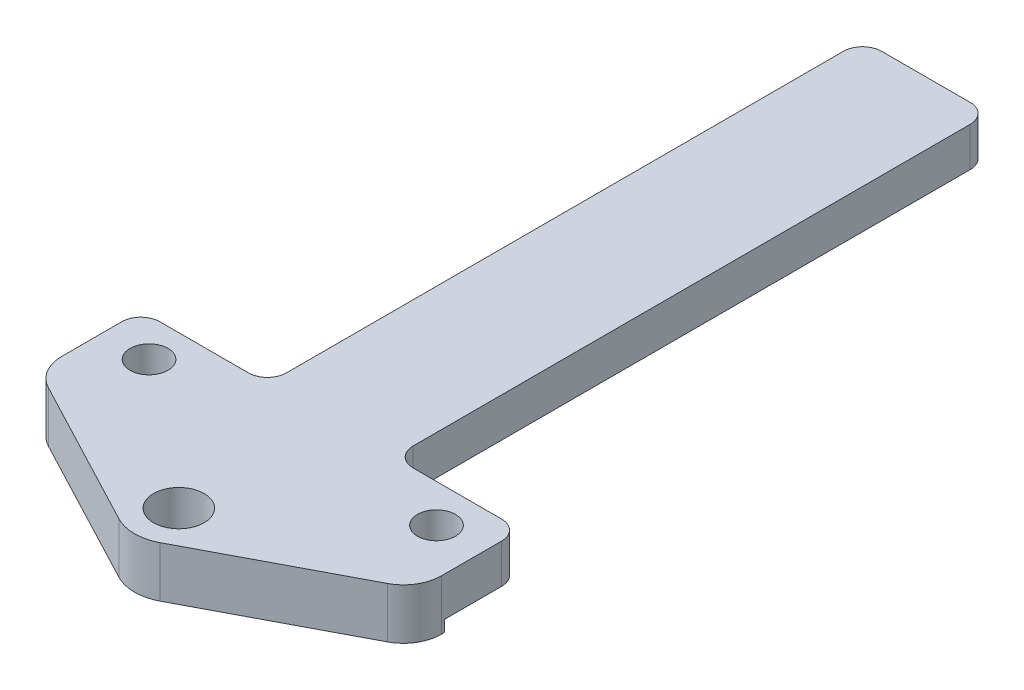
ISO-10303-21;
HEADER;
FILE_DESCRIPTION(('STEP AP214'),'2;1');
FILE_NAME('part.step','',(''),(''),'','','');
FILE_SCHEMA(('AUTOMOTIVE_DESIGN { 1 0 10303 214 1 1 1 1 }'));
ENDSEC;
DATA;
#1=APPLICATION_CONTEXT('core data for automotive mechanical design processes');
#2=APPLICATION_PROTOCOL_DEFINITION('international standard','automotive_design',2000,#1);
#3=PRODUCT_CONTEXT('',#1,'mechanical');
#4=PRODUCT('Part','Part','',(#3));
#5=PRODUCT_RELATED_PRODUCT_CATEGORY('part','',(#4));
#6=PRODUCT_DEFINITION_FORMATION('','',#4);
#7=PRODUCT_DEFINITION_CONTEXT('part definition',#1,'design');
#8=PRODUCT_DEFINITION('design','',#6,#7);
#9=PRODUCT_DEFINITION_SHAPE('','',#8);
#10=(LENGTH_UNIT() NAMED_UNIT(*) SI_UNIT(.MILLI.,.METRE.));
#11=(NAMED_UNIT(*) PLANE_ANGLE_UNIT() SI_UNIT($,.RADIAN.));
#12=(NAMED_UNIT(*) SI_UNIT($,.STERADIAN.) SOLID_ANGLE_UNIT());
#13=UNCERTAINTY_MEASURE_WITH_UNIT(LENGTH_MEASURE(1.E-05),#10,'distance_accuracy_value','');
#14=(GEOMETRIC_REPRESENTATION_CONTEXT(3) GLOBAL_UNCERTAINTY_ASSIGNED_CONTEXT((#13)) GLOBAL_UNIT_ASSIGNED_CONTEXT((#10,
#11,#12)) REPRESENTATION_CONTEXT('',''));
#15=CARTESIAN_POINT('',(0.,0.,0.));
#16=DIRECTION('',(0.,0.,1.));
#17=DIRECTION('',(1.,0.,0.));
#18=AXIS2_PLACEMENT_3D('',#15,#16,#17);
#19=CARTESIAN_POINT('',(12.,2.,-5.74612507928939));
#20=DIRECTION('',(0.,-1.,0.));
#21=DIRECTION('',(0.,0.,-1.));
#22=AXIS2_PLACEMENT_3D('',#19,#20,#21);
#23=PLANE('',#22);
#24=DIRECTION('',(0.,0.,-1.));
#25=VECTOR('',#24,1.);
#26=CARTESIAN_POINT('',(5.,2.,-59.));
#27=LINE('',#26,#25);
#28=CARTESIAN_POINT('',(5.,2.,-13.5));
#29=VERTEX_POINT('',#28);
#30=CARTESIAN_POINT('',(5.,2.,-57.5));
#31=VERTEX_POINT('',#30);
#32=EDGE_CURVE('E254',#29,#31,#27,.T.);
#33=ORIENTED_EDGE('',*,*,#32,.T.);
#34=CARTESIAN_POINT('',(3.5,2.,-57.5));
#35=DIRECTION('',(0.,-1.,0.));
#36=DIRECTION('',(0.,0.,-1.));
#37=AXIS2_PLACEMENT_3D('',#34,#35,#36);
#38=CIRCLE('',#37,1.5);
#39=CARTESIAN_POINT('',(3.5,2.,-59.));
#40=VERTEX_POINT('',#39);
#41=EDGE_CURVE('E334',#31,#40,#38,.F.);
#42=ORIENTED_EDGE('',*,*,#41,.T.);
#43=DIRECTION('',(-1.,0.,0.));
#44=VECTOR('',#43,1.);
#45=CARTESIAN_POINT('',(-5.,2.,-59.));
#46=LINE('',#45,#44);
#47=CARTESIAN_POINT('',(-3.5,2.,-59.));
#48=VERTEX_POINT('',#47);
#49=EDGE_CURVE('E257',#40,#48,#46,.T.);
#50=ORIENTED_EDGE('',*,*,#49,.T.);
#51=CARTESIAN_POINT('',(-3.5,2.,-57.5));
#52=DIRECTION('',(0.,-1.,0.));
#53=DIRECTION('',(0.,0.,-1.));
#54=AXIS2_PLACEMENT_3D('',#51,#52,#53);
#55=CIRCLE('',#54,1.5);
#56=CARTESIAN_POINT('',(-5.,2.,-57.5));
#57=VERTEX_POINT('',#56);
#58=EDGE_CURVE('E332',#48,#57,#55,.F.);
#59=ORIENTED_EDGE('',*,*,#58,.T.);
#60=DIRECTION('',(0.,0.,1.));
#61=VECTOR('',#60,1.);
#62=CARTESIAN_POINT('',(-5.,2.,-59.));
#63=LINE('',#62,#61);
#64=CARTESIAN_POINT('',(-5.,2.,-13.5));
#65=VERTEX_POINT('',#64);
#66=EDGE_CURVE('E260',#57,#65,#63,.T.);
#67=ORIENTED_EDGE('',*,*,#66,.T.);
#68=CARTESIAN_POINT('',(-6.5,2.,-13.5));
#69=DIRECTION('',(0.,-1.,0.));
#70=DIRECTION('',(0.,0.,-1.));
#71=AXIS2_PLACEMENT_3D('',#68,#69,#70);
#72=CIRCLE('',#71,1.5);
#73=CARTESIAN_POINT('',(-6.5,2.,-12.));
#74=VERTEX_POINT('',#73);
#75=EDGE_CURVE('E11',#65,#74,#72,.T.);
#76=ORIENTED_EDGE('',*,*,#75,.T.);
#77=DIRECTION('',(-1.,0.,0.));
#78=VECTOR('',#77,1.);
#79=CARTESIAN_POINT('',(-13.5,2.,-12.));
#80=LINE('',#79,#78);
#81=CARTESIAN_POINT('',(-13.5,2.,-12.));
#82=VERTEX_POINT('',#81);
#83=EDGE_CURVE('E262',#74,#82,#80,.T.);
#84=ORIENTED_EDGE('',*,*,#83,.T.);
#85=CARTESIAN_POINT('',(-13.5,2.,-10.5));
#86=DIRECTION('',(0.,1.,0.));
#87=DIRECTION('',(0.,0.,1.));
#88=AXIS2_PLACEMENT_3D('',#85,#86,#87);
#89=CIRCLE('',#88,1.5);
#90=CARTESIAN_POINT('',(-15.,2.,-10.5));
#91=VERTEX_POINT('',#90);
#92=EDGE_CURVE('E264',#82,#91,#89,.T.);
#93=ORIENTED_EDGE('',*,*,#92,.T.);
#94=DIRECTION('',(0.,0.,1.));
#95=VECTOR('',#94,1.);
#96=CARTESIAN_POINT('',(-15.,2.,-10.5));
#97=LINE('',#96,#95);
#98=CARTESIAN_POINT('',(-15.,2.,-5.7461250792894));
#99=VERTEX_POINT('',#98);
#100=EDGE_CURVE('E266',#91,#99,#97,.T.);
#101=ORIENTED_EDGE('',*,*,#100,.T.);
#102=CARTESIAN_POINT('',(-12.,2.,-5.74612507928939));
#103=DIRECTION('',(0.,1.,0.));
#104=DIRECTION('',(0.,0.,-1.));
#105=AXIS2_PLACEMENT_3D('',#102,#103,#104);
#106=CIRCLE('',#105,3.);
#107=CARTESIAN_POINT('',(-13.3964192830384,2.,-3.09093898676054));
#108=VERTEX_POINT('',#107);
#109=EDGE_CURVE('E268',#99,#108,#106,.T.);
#110=ORIENTED_EDGE('',*,*,#109,.T.);
#111=DIRECTION('',(0.885062030842948,0.,0.465473094346124));
#112=VECTOR('',#111,1.);
#113=CARTESIAN_POINT('',(-1.62915583021145,2.,3.09771710795034));
#114=LINE('',#113,#112);
#115=CARTESIAN_POINT('',(-1.62915583021145,2.,3.09771710795034));
#116=VERTEX_POINT('',#115);
#117=EDGE_CURVE('E270',#108,#116,#114,.T.);
#118=ORIENTED_EDGE('',*,*,#117,.T.);
#119=CARTESIAN_POINT('',(0.,2.,0.));
#120=DIRECTION('',(0.,1.,0.));
#121=DIRECTION('',(0.,0.,1.));
#122=AXIS2_PLACEMENT_3D('',#119,#120,#121);
#123=CIRCLE('',#122,3.50000000000003);
#124=CARTESIAN_POINT('',(1.62915583021145,2.,3.09771710795034));
#125=VERTEX_POINT('',#124);
#126=EDGE_CURVE('E272',#116,#125,#123,.T.);
#127=ORIENTED_EDGE('',*,*,#126,.T.);
#128=DIRECTION('',(0.885062030842948,0.,-0.465473094346124));
#129=VECTOR('',#128,1.);
#130=CARTESIAN_POINT('',(1.62915583021145,2.,3.09771710795034));
#131=LINE('',#130,#129);
#132=CARTESIAN_POINT('',(13.3964192830384,2.,-3.09093898676054));
#133=VERTEX_POINT('',#132);
#134=EDGE_CURVE('E274',#125,#133,#131,.T.);
#135=ORIENTED_EDGE('',*,*,#134,.T.);
#136=CARTESIAN_POINT('',(12.,2.,-5.74612507928939));
#137=DIRECTION('',(0.,1.,0.));
#138=DIRECTION('',(0.,0.,-1.));
#139=AXIS2_PLACEMENT_3D('',#136,#137,#138);
#140=CIRCLE('',#139,3.);
#141=CARTESIAN_POINT('',(15.,2.,-5.7461250792894));
#142=VERTEX_POINT('',#141);
#143=EDGE_CURVE('E243',#133,#142,#140,.T.);
#144=ORIENTED_EDGE('',*,*,#143,.T.);
#145=DIRECTION('',(0.,0.,-1.));
#146=VECTOR('',#145,1.);
#147=CARTESIAN_POINT('',(15.,2.,-10.5));
#148=LINE('',#147,#146);
#149=CARTESIAN_POINT('',(15.,2.,-10.5));
#150=VERTEX_POINT('',#149);
#151=EDGE_CURVE('E246',#142,#150,#148,.T.);
#152=ORIENTED_EDGE('',*,*,#151,.T.);
#153=CARTESIAN_POINT('',(13.5,2.,-10.5));
#154=DIRECTION('',(0.,1.,0.));
#155=DIRECTION('',(0.,0.,1.));
#156=AXIS2_PLACEMENT_3D('',#153,#154,#155);
#157=CIRCLE('',#156,1.5);
#158=CARTESIAN_POINT('',(13.5,2.,-12.));
#159=VERTEX_POINT('',#158);
#160=EDGE_CURVE('E249',#150,#159,#157,.T.);
#161=ORIENTED_EDGE('',*,*,#160,.T.);
#162=DIRECTION('',(-1.,0.,0.));
#163=VECTOR('',#162,1.);
#164=CARTESIAN_POINT('',(5.,2.,-12.));
#165=LINE('',#164,#163);
#166=CARTESIAN_POINT('',(6.5,2.,-12.));
#167=VERTEX_POINT('',#166);
#168=EDGE_CURVE('E251',#159,#167,#165,.T.);
#169=ORIENTED_EDGE('',*,*,#168,.T.);
#170=CARTESIAN_POINT('',(6.5,2.,-13.5));
#171=DIRECTION('',(0.,-1.,0.));
#172=DIRECTION('',(0.,0.,-1.));
#173=AXIS2_PLACEMENT_3D('',#170,#171,#172);
#174=CIRCLE('',#173,1.5);
#175=EDGE_CURVE('E347',#167,#29,#174,.T.);
#176=ORIENTED_EDGE('',*,*,#175,.T.);
#177=EDGE_LOOP('',(#33,#42,#50,#59,#67,#76,#84,#93,#101,#110,#118,#127,#135,#144,#152,#161,#169,#176));
#178=FACE_BOUND('',#177,.T.);
#179=CARTESIAN_POINT('',(0.,2.,0.));
#180=DIRECTION('',(0.,1.,0.));
#181=DIRECTION('',(0.,0.,1.));
#182=AXIS2_PLACEMENT_3D('',#179,#180,#181);
#183=CIRCLE('',#182,2.);
#184=CARTESIAN_POINT('',(0.,2.,2.));
#185=VERTEX_POINT('',#184);
#186=EDGE_CURVE('E237',#185,#185,#183,.T.);
#187=ORIENTED_EDGE('',*,*,#186,.F.);
#188=EDGE_LOOP('',(#187));
#189=FACE_BOUND('',#188,.T.);
#190=CARTESIAN_POINT('',(-11.35,2.,-9.));
#191=DIRECTION('',(0.,1.,0.));
#192=DIRECTION('',(0.,0.,1.));
#193=AXIS2_PLACEMENT_3D('',#190,#191,#192);
#194=CIRCLE('',#193,1.5);
#195=CARTESIAN_POINT('',(-11.35,2.,-7.5));
#196=VERTEX_POINT('',#195);
#197=EDGE_CURVE('E233',#196,#196,#194,.T.);
#198=ORIENTED_EDGE('',*,*,#197,.F.);
#199=EDGE_LOOP('',(#198));
#200=FACE_BOUND('',#199,.T.);
#201=CARTESIAN_POINT('',(11.35,2.,-9.));
#202=DIRECTION('',(0.,1.,0.));
#203=DIRECTION('',(0.,0.,-1.));
#204=AXIS2_PLACEMENT_3D('',#201,#202,#203);
#205=CIRCLE('',#204,1.5);
#206=CARTESIAN_POINT('',(11.35,2.,-10.5));
#207=VERTEX_POINT('',#206);
#208=EDGE_CURVE('E228',#207,#207,#205,.T.);
#209=ORIENTED_EDGE('',*,*,#208,.F.);
#210=EDGE_LOOP('',(#209));
#211=FACE_BOUND('',#210,.T.);
#212=ADVANCED_FACE('F39',(#178,#189,#200,#211),#23,.F.);
#213=CARTESIAN_POINT('',(12.,-2.,-5.74612507928939));
#214=DIRECTION('',(0.,-1.,0.));
#215=DIRECTION('',(0.,0.,-1.));
#216=AXIS2_PLACEMENT_3D('',#213,#214,#215);
#217=PLANE('',#216);
#218=DIRECTION('',(-1.,0.,0.));
#219=VECTOR('',#218,1.);
#220=CARTESIAN_POINT('',(15.001,-2.,-6.));
#221=LINE('',#220,#219);
#222=CARTESIAN_POINT('',(15.,-2.,-6.));
#223=VERTEX_POINT('',#222);
#224=CARTESIAN_POINT('',(-15.,-2.,-6.));
#225=VERTEX_POINT('',#224);
#226=EDGE_CURVE('E189',#223,#225,#221,.T.);
#227=ORIENTED_EDGE('',*,*,#226,.F.);
#228=DIRECTION('',(0.,0.,-1.));
#229=VECTOR('',#228,1.);
#230=CARTESIAN_POINT('',(15.,-2.,-10.5));
#231=LINE('',#230,#229);
#232=CARTESIAN_POINT('',(15.,-2.,-5.7461250792894));
#233=VERTEX_POINT('',#232);
#234=EDGE_CURVE('E279',#233,#223,#231,.T.);
#235=ORIENTED_EDGE('',*,*,#234,.F.);
#236=CARTESIAN_POINT('',(12.,-2.,-5.74612507928939));
#237=DIRECTION('',(0.,1.,0.));
#238=DIRECTION('',(0.,0.,-1.));
#239=AXIS2_PLACEMENT_3D('',#236,#237,#238);
#240=CIRCLE('',#239,3.);
#241=CARTESIAN_POINT('',(13.3964192830384,-2.,-3.09093898676054));
#242=VERTEX_POINT('',#241);
#243=EDGE_CURVE('E240',#242,#233,#240,.T.);
#244=ORIENTED_EDGE('',*,*,#243,.F.);
#245=DIRECTION('',(0.885062030842948,0.,-0.465473094346124));
#246=VECTOR('',#245,1.);
#247=CARTESIAN_POINT('',(1.62915583021145,-2.,3.09771710795034));
#248=LINE('',#247,#246);
#249=CARTESIAN_POINT('',(1.62915583021145,-2.,3.09771710795034));
#250=VERTEX_POINT('',#249);
#251=EDGE_CURVE('E247',#250,#242,#248,.T.);
#252=ORIENTED_EDGE('',*,*,#251,.F.);
#253=CARTESIAN_POINT('',(0.,-2.,0.));
#254=DIRECTION('',(0.,1.,0.));
#255=DIRECTION('',(0.,0.,1.));
#256=AXIS2_PLACEMENT_3D('',#253,#254,#255);
#257=CIRCLE('',#256,3.50000000000003);
#258=CARTESIAN_POINT('',(-1.62915583021145,-2.,3.09771710795034));
#259=VERTEX_POINT('',#258);
#260=EDGE_CURVE('E288',#259,#250,#257,.T.);
#261=ORIENTED_EDGE('',*,*,#260,.F.);
#262=DIRECTION('',(0.885062030842948,0.,0.465473094346124));
#263=VECTOR('',#262,1.);
#264=CARTESIAN_POINT('',(-1.62915583021145,-2.,3.09771710795034));
#265=LINE('',#264,#263);
#266=CARTESIAN_POINT('',(-13.3964192830384,-2.,-3.09093898676054));
#267=VERTEX_POINT('',#266);
#268=EDGE_CURVE('E286',#267,#259,#265,.T.);
#269=ORIENTED_EDGE('',*,*,#268,.F.);
#270=CARTESIAN_POINT('',(-12.,-2.,-5.74612507928939));
#271=DIRECTION('',(0.,1.,0.));
#272=DIRECTION('',(0.,0.,-1.));
#273=AXIS2_PLACEMENT_3D('',#270,#271,#272);
#274=CIRCLE('',#273,3.);
#275=CARTESIAN_POINT('',(-15.,-2.,-5.7461250792894));
#276=VERTEX_POINT('',#275);
#277=EDGE_CURVE('E284',#276,#267,#274,.T.);
#278=ORIENTED_EDGE('',*,*,#277,.F.);
#279=DIRECTION('',(0.,0.,1.));
#280=VECTOR('',#279,1.);
#281=CARTESIAN_POINT('',(-15.,-2.,-10.5));
#282=LINE('',#281,#280);
#283=EDGE_CURVE('E282',#225,#276,#282,.T.);
#284=ORIENTED_EDGE('',*,*,#283,.F.);
#285=EDGE_LOOP('',(#227,#235,#244,#252,#261,#269,#278,#284));
#286=FACE_BOUND('',#285,.T.);
#287=CARTESIAN_POINT('',(0.,-2.,0.));
#288=DIRECTION('',(0.,1.,0.));
#289=DIRECTION('',(0.,0.,1.));
#290=AXIS2_PLACEMENT_3D('',#287,#288,#289);
#291=CIRCLE('',#290,2.);
#292=CARTESIAN_POINT('',(0.,-2.,2.));
#293=VERTEX_POINT('',#292);
#294=EDGE_CURVE('E236',#293,#293,#291,.T.);
#295=ORIENTED_EDGE('',*,*,#294,.T.);
#296=EDGE_LOOP('',(#295));
#297=FACE_BOUND('',#296,.T.);
#298=ADVANCED_FACE('F426',(#286,#297),#217,.T.);
#299=CARTESIAN_POINT('',(12.,2.,-5.74612507928939));
#300=DIRECTION('',(0.,-1.,0.));
#301=DIRECTION('',(0.,0.,-1.));
#302=AXIS2_PLACEMENT_3D('',#299,#300,#301);
#303=CYLINDRICAL_SURFACE('',#302,3.);
#304=ORIENTED_EDGE('',*,*,#243,.T.);
#305=DIRECTION('',(0.,-1.,0.));
#306=VECTOR('',#305,1.);
#307=CARTESIAN_POINT('',(15.,2.,-5.7461250792894));
#308=LINE('',#307,#306);
#309=EDGE_CURVE('E315',#142,#233,#308,.T.);
#310=ORIENTED_EDGE('',*,*,#309,.F.);
#311=ORIENTED_EDGE('',*,*,#143,.F.);
#312=DIRECTION('',(0.,-1.,0.));
#313=VECTOR('',#312,1.);
#314=CARTESIAN_POINT('',(13.3964192830384,2.,-3.09093898676054));
#315=LINE('',#314,#313);
#316=EDGE_CURVE('E276',#133,#242,#315,.T.);
#317=ORIENTED_EDGE('',*,*,#316,.T.);
#318=EDGE_LOOP('',(#304,#310,#311,#317));
#319=FACE_BOUND('',#318,.T.);
#320=ADVANCED_FACE('F385',(#319),#303,.T.);
#321=CARTESIAN_POINT('',(15.,2.,-10.5));
#322=DIRECTION('',(-1.,0.,0.));
#323=DIRECTION('',(0.,0.,1.));
#324=AXIS2_PLACEMENT_3D('',#321,#322,#323);
#325=PLANE('',#324);
#326=DIRECTION('',(0.,-1.,0.));
#327=VECTOR('',#326,1.);
#328=CARTESIAN_POINT('',(15.,-2.,-6.));
#329=LINE('',#328,#327);
#330=CARTESIAN_POINT('',(15.,-1.1,-6.));
#331=VERTEX_POINT('',#330);
#332=EDGE_CURVE('E221',#331,#223,#329,.T.);
#333=ORIENTED_EDGE('',*,*,#332,.F.);
#334=DIRECTION('',(0.,0.,1.));
#335=VECTOR('',#334,1.);
#336=CARTESIAN_POINT('',(15.,-1.1,-59.));
#337=LINE('',#336,#335);
#338=CARTESIAN_POINT('',(15.,-1.1,-10.5));
#339=VERTEX_POINT('',#338);
#340=EDGE_CURVE('E185',#339,#331,#337,.T.);
#341=ORIENTED_EDGE('',*,*,#340,.F.);
#342=DIRECTION('',(0.,-1.,0.));
#343=VECTOR('',#342,1.);
#344=CARTESIAN_POINT('',(15.,2.,-10.5));
#345=LINE('',#344,#343);
#346=EDGE_CURVE('E312',#150,#339,#345,.T.);
#347=ORIENTED_EDGE('',*,*,#346,.F.);
#348=ORIENTED_EDGE('',*,*,#151,.F.);
#349=ORIENTED_EDGE('',*,*,#309,.T.);
#350=ORIENTED_EDGE('',*,*,#234,.T.);
#351=EDGE_LOOP('',(#333,#341,#347,#348,#349,#350));
#352=FACE_BOUND('',#351,.T.);
#353=ADVANCED_FACE('F388',(#352),#325,.F.);
#354=CARTESIAN_POINT('',(13.5,2.,-10.5));
#355=DIRECTION('',(0.,-1.,0.));
#356=DIRECTION('',(0.,0.,-1.));
#357=AXIS2_PLACEMENT_3D('',#354,#355,#356);
#358=CYLINDRICAL_SURFACE('',#357,1.5);
#359=ORIENTED_EDGE('',*,*,#346,.T.);
#360=CARTESIAN_POINT('',(13.5,-1.1,-10.5));
#361=DIRECTION('',(0.,1.,0.));
#362=DIRECTION('',(0.,0.,1.));
#363=AXIS2_PLACEMENT_3D('',#360,#361,#362);
#364=CIRCLE('',#363,1.5);
#365=CARTESIAN_POINT('',(13.5,-1.1,-12.));
#366=VERTEX_POINT('',#365);
#367=EDGE_CURVE('E219',#366,#339,#364,.F.);
#368=ORIENTED_EDGE('',*,*,#367,.F.);
#369=DIRECTION('',(0.,-1.,0.));
#370=VECTOR('',#369,1.);
#371=CARTESIAN_POINT('',(13.5,2.,-12.));
#372=LINE('',#371,#370);
#373=EDGE_CURVE('E309',#159,#366,#372,.T.);
#374=ORIENTED_EDGE('',*,*,#373,.F.);
#375=ORIENTED_EDGE('',*,*,#160,.F.);
#376=EDGE_LOOP('',(#359,#368,#374,#375));
#377=FACE_BOUND('',#376,.T.);
#378=ADVANCED_FACE('F393',(#377),#358,.T.);
#379=CARTESIAN_POINT('',(5.,2.,-12.));
#380=DIRECTION('',(0.,0.,1.));
#381=DIRECTION('',(1.,0.,0.));
#382=AXIS2_PLACEMENT_3D('',#379,#380,#381);
#383=PLANE('',#382);
#384=DIRECTION('',(1.,0.,0.));
#385=VECTOR('',#384,1.);
#386=CARTESIAN_POINT('',(15.001,-1.1,-12.));
#387=LINE('',#386,#385);
#388=CARTESIAN_POINT('',(6.5,-1.1,-12.));
#389=VERTEX_POINT('',#388);
#390=EDGE_CURVE('E217',#389,#366,#387,.T.);
#391=ORIENTED_EDGE('',*,*,#390,.F.);
#392=DIRECTION('',(0.,-1.,0.));
#393=VECTOR('',#392,1.);
#394=CARTESIAN_POINT('',(6.5,2.,-12.));
#395=LINE('',#394,#393);
#396=EDGE_CURVE('E340',#389,#167,#395,.F.);
#397=ORIENTED_EDGE('',*,*,#396,.T.);
#398=ORIENTED_EDGE('',*,*,#168,.F.);
#399=ORIENTED_EDGE('',*,*,#373,.T.);
#400=EDGE_LOOP('',(#391,#397,#398,#399));
#401=FACE_BOUND('',#400,.T.);
#402=ADVANCED_FACE('F459',(#401),#383,.F.);
#403=CARTESIAN_POINT('',(5.,2.,-59.));
#404=DIRECTION('',(-1.,0.,0.));
#405=DIRECTION('',(0.,0.,1.));
#406=AXIS2_PLACEMENT_3D('',#403,#404,#405);
#407=PLANE('',#406);
#408=DIRECTION('',(0.,0.,1.));
#409=VECTOR('',#408,1.);
#410=CARTESIAN_POINT('',(5.,-1.1,-59.));
#411=LINE('',#410,#409);
#412=CARTESIAN_POINT('',(5.,-1.1,-57.5));
#413=VERTEX_POINT('',#412);
#414=CARTESIAN_POINT('',(5.,-1.1,-13.5));
#415=VERTEX_POINT('',#414);
#416=EDGE_CURVE('E214',#413,#415,#411,.T.);
#417=ORIENTED_EDGE('',*,*,#416,.F.);
#418=DIRECTION('',(0.,-1.,0.));
#419=VECTOR('',#418,1.);
#420=CARTESIAN_POINT('',(5.,2.,-57.5));
#421=LINE('',#420,#419);
#422=EDGE_CURVE('E330',#413,#31,#421,.F.);
#423=ORIENTED_EDGE('',*,*,#422,.T.);
#424=ORIENTED_EDGE('',*,*,#32,.F.);
#425=DIRECTION('',(0.,-1.,0.));
#426=VECTOR('',#425,1.);
#427=CARTESIAN_POINT('',(5.,-1.1,-13.5));
#428=LINE('',#427,#426);
#429=EDGE_CURVE('E327',#29,#415,#428,.T.);
#430=ORIENTED_EDGE('',*,*,#429,.T.);
#431=EDGE_LOOP('',(#417,#423,#424,#430));
#432=FACE_BOUND('',#431,.T.);
#433=ADVANCED_FACE('F404',(#432),#407,.F.);
#434=CARTESIAN_POINT('',(-5.,2.,-59.));
#435=DIRECTION('',(0.,0.,1.));
#436=DIRECTION('',(1.,0.,0.));
#437=AXIS2_PLACEMENT_3D('',#434,#435,#436);
#438=PLANE('',#437);
#439=ORIENTED_EDGE('',*,*,#49,.F.);
#440=DIRECTION('',(0.,-1.,0.));
#441=VECTOR('',#440,1.);
#442=CARTESIAN_POINT('',(3.5,2.,-59.));
#443=LINE('',#442,#441);
#444=CARTESIAN_POINT('',(3.5,-1.1,-59.));
#445=VERTEX_POINT('',#444);
#446=EDGE_CURVE('E320',#40,#445,#443,.T.);
#447=ORIENTED_EDGE('',*,*,#446,.T.);
#448=DIRECTION('',(-1.,0.,0.));
#449=VECTOR('',#448,1.);
#450=CARTESIAN_POINT('',(15.001,-1.1,-59.));
#451=LINE('',#450,#449);
#452=CARTESIAN_POINT('',(-3.5,-1.1,-59.));
#453=VERTEX_POINT('',#452);
#454=EDGE_CURVE('E188',#445,#453,#451,.T.);
#455=ORIENTED_EDGE('',*,*,#454,.T.);
#456=DIRECTION('',(0.,-1.,0.));
#457=VECTOR('',#456,1.);
#458=CARTESIAN_POINT('',(-3.5,2.,-59.));
#459=LINE('',#458,#457);
#460=EDGE_CURVE('E318',#453,#48,#459,.F.);
#461=ORIENTED_EDGE('',*,*,#460,.T.);
#462=EDGE_LOOP('',(#439,#447,#455,#461));
#463=FACE_BOUND('',#462,.T.);
#464=ADVANCED_FACE('F413',(#463),#438,.F.);
#465=CARTESIAN_POINT('',(-5.,2.,-59.));
#466=DIRECTION('',(1.,0.,0.));
#467=DIRECTION('',(0.,0.,-1.));
#468=AXIS2_PLACEMENT_3D('',#465,#466,#467);
#469=PLANE('',#468);
#470=ORIENTED_EDGE('',*,*,#66,.F.);
#471=DIRECTION('',(0.,-1.,0.));
#472=VECTOR('',#471,1.);
#473=CARTESIAN_POINT('',(-5.,2.,-57.5));
#474=LINE('',#473,#472);
#475=CARTESIAN_POINT('',(-5.,-1.1,-57.5));
#476=VERTEX_POINT('',#475);
#477=EDGE_CURVE('E337',#57,#476,#474,.T.);
#478=ORIENTED_EDGE('',*,*,#477,.T.);
#479=DIRECTION('',(0.,0.,-1.));
#480=VECTOR('',#479,1.);
#481=CARTESIAN_POINT('',(-5.,-1.1,-59.));
#482=LINE('',#481,#480);
#483=CARTESIAN_POINT('',(-5.,-1.1,-13.5));
#484=VERTEX_POINT('',#483);
#485=EDGE_CURVE('E224',#484,#476,#482,.T.);
#486=ORIENTED_EDGE('',*,*,#485,.F.);
#487=DIRECTION('',(0.,-1.,0.));
#488=VECTOR('',#487,1.);
#489=CARTESIAN_POINT('',(-5.,2.,-13.5));
#490=LINE('',#489,#488);
#491=EDGE_CURVE('E60',#484,#65,#490,.F.);
#492=ORIENTED_EDGE('',*,*,#491,.T.);
#493=EDGE_LOOP('',(#470,#478,#486,#492));
#494=FACE_BOUND('',#493,.T.);
#495=ADVANCED_FACE('F351',(#494),#469,.F.);
#496=CARTESIAN_POINT('',(-13.5,2.,-12.));
#497=DIRECTION('',(0.,0.,1.));
#498=DIRECTION('',(1.,0.,0.));
#499=AXIS2_PLACEMENT_3D('',#496,#497,#498);
#500=PLANE('',#499);
#501=ORIENTED_EDGE('',*,*,#83,.F.);
#502=DIRECTION('',(0.,-1.,0.));
#503=VECTOR('',#502,1.);
#504=CARTESIAN_POINT('',(-6.5,-1.1,-12.));
#505=LINE('',#504,#503);
#506=CARTESIAN_POINT('',(-6.5,-1.1,-12.));
#507=VERTEX_POINT('',#506);
#508=EDGE_CURVE('E342',#74,#507,#505,.T.);
#509=ORIENTED_EDGE('',*,*,#508,.T.);
#510=DIRECTION('',(-1.,0.,0.));
#511=VECTOR('',#510,1.);
#512=CARTESIAN_POINT('',(-15.001,-1.1,-12.));
#513=LINE('',#512,#511);
#514=CARTESIAN_POINT('',(-13.5,-1.1,-12.));
#515=VERTEX_POINT('',#514);
#516=EDGE_CURVE('E198',#507,#515,#513,.T.);
#517=ORIENTED_EDGE('',*,*,#516,.T.);
#518=DIRECTION('',(0.,-1.,0.));
#519=VECTOR('',#518,1.);
#520=CARTESIAN_POINT('',(-13.5,2.,-12.));
#521=LINE('',#520,#519);
#522=EDGE_CURVE('E306',#82,#515,#521,.T.);
#523=ORIENTED_EDGE('',*,*,#522,.F.);
#524=EDGE_LOOP('',(#501,#509,#517,#523));
#525=FACE_BOUND('',#524,.T.);
#526=ADVANCED_FACE('F354',(#525),#500,.F.);
#527=CARTESIAN_POINT('',(-13.5,2.,-10.5));
#528=DIRECTION('',(0.,-1.,0.));
#529=DIRECTION('',(0.,0.,-1.));
#530=AXIS2_PLACEMENT_3D('',#527,#528,#529);
#531=CYLINDRICAL_SURFACE('',#530,1.5);
#532=ORIENTED_EDGE('',*,*,#522,.T.);
#533=CARTESIAN_POINT('',(-13.5,-1.1,-10.5));
#534=DIRECTION('',(0.,-1.,0.));
#535=DIRECTION('',(0.,0.,-1.));
#536=AXIS2_PLACEMENT_3D('',#533,#534,#535);
#537=CIRCLE('',#536,1.5);
#538=CARTESIAN_POINT('',(-15.,-1.1,-10.5));
#539=VERTEX_POINT('',#538);
#540=EDGE_CURVE('E205',#515,#539,#537,.F.);
#541=ORIENTED_EDGE('',*,*,#540,.T.);
#542=DIRECTION('',(0.,-1.,0.));
#543=VECTOR('',#542,1.);
#544=CARTESIAN_POINT('',(-15.,2.,-10.5));
#545=LINE('',#544,#543);
#546=EDGE_CURVE('E204',#91,#539,#545,.T.);
#547=ORIENTED_EDGE('',*,*,#546,.F.);
#548=ORIENTED_EDGE('',*,*,#92,.F.);
#549=EDGE_LOOP('',(#532,#541,#547,#548));
#550=FACE_BOUND('',#549,.T.);
#551=ADVANCED_FACE('F360',(#550),#531,.T.);
#552=CARTESIAN_POINT('',(-15.,2.,-10.5));
#553=DIRECTION('',(1.,0.,0.));
#554=DIRECTION('',(0.,0.,-1.));
#555=AXIS2_PLACEMENT_3D('',#552,#553,#554);
#556=PLANE('',#555);
#557=ORIENTED_EDGE('',*,*,#546,.T.);
#558=DIRECTION('',(0.,0.,1.));
#559=VECTOR('',#558,1.);
#560=CARTESIAN_POINT('',(-15.,-1.1,-59.));
#561=LINE('',#560,#559);
#562=CARTESIAN_POINT('',(-15.,-1.1,-6.));
#563=VERTEX_POINT('',#562);
#564=EDGE_CURVE('E182',#539,#563,#561,.T.);
#565=ORIENTED_EDGE('',*,*,#564,.T.);
#566=DIRECTION('',(0.,-1.,0.));
#567=VECTOR('',#566,1.);
#568=CARTESIAN_POINT('',(-15.,-2.,-6.));
#569=LINE('',#568,#567);
#570=EDGE_CURVE('E192',#563,#225,#569,.T.);
#571=ORIENTED_EDGE('',*,*,#570,.T.);
#572=ORIENTED_EDGE('',*,*,#283,.T.);
#573=DIRECTION('',(0.,-1.,0.));
#574=VECTOR('',#573,1.);
#575=CARTESIAN_POINT('',(-15.,2.,-5.7461250792894));
#576=LINE('',#575,#574);
#577=EDGE_CURVE('E302',#99,#276,#576,.T.);
#578=ORIENTED_EDGE('',*,*,#577,.F.);
#579=ORIENTED_EDGE('',*,*,#100,.F.);
#580=EDGE_LOOP('',(#557,#565,#571,#572,#578,#579));
#581=FACE_BOUND('',#580,.T.);
#582=ADVANCED_FACE('F201',(#581),#556,.F.);
#583=CARTESIAN_POINT('',(-12.,2.,-5.74612507928939));
#584=DIRECTION('',(0.,-1.,0.));
#585=DIRECTION('',(0.,0.,-1.));
#586=AXIS2_PLACEMENT_3D('',#583,#584,#585);
#587=CYLINDRICAL_SURFACE('',#586,3.);
#588=ORIENTED_EDGE('',*,*,#277,.T.);
#589=DIRECTION('',(0.,-1.,0.));
#590=VECTOR('',#589,1.);
#591=CARTESIAN_POINT('',(-13.3964192830384,2.,-3.09093898676054));
#592=LINE('',#591,#590);
#593=EDGE_CURVE('E299',#108,#267,#592,.T.);
#594=ORIENTED_EDGE('',*,*,#593,.F.);
#595=ORIENTED_EDGE('',*,*,#109,.F.);
#596=ORIENTED_EDGE('',*,*,#577,.T.);
#597=EDGE_LOOP('',(#588,#594,#595,#596));
#598=FACE_BOUND('',#597,.T.);
#599=ADVANCED_FACE('F365',(#598),#587,.T.);
#600=CARTESIAN_POINT('',(-1.62915583021145,2.,3.09771710795034));
#601=DIRECTION('',(0.465473094346124,0.,-0.885062030842948));
#602=DIRECTION('',(-0.885062030842948,0.,-0.465473094346124));
#603=AXIS2_PLACEMENT_3D('',#600,#601,#602);
#604=PLANE('',#603);
#605=ORIENTED_EDGE('',*,*,#268,.T.);
#606=DIRECTION('',(0.,-1.,0.));
#607=VECTOR('',#606,1.);
#608=CARTESIAN_POINT('',(-1.62915583021145,2.,3.09771710795034));
#609=LINE('',#608,#607);
#610=EDGE_CURVE('E296',#116,#259,#609,.T.);
#611=ORIENTED_EDGE('',*,*,#610,.F.);
#612=ORIENTED_EDGE('',*,*,#117,.F.);
#613=ORIENTED_EDGE('',*,*,#593,.T.);
#614=EDGE_LOOP('',(#605,#611,#612,#613));
#615=FACE_BOUND('',#614,.T.);
#616=ADVANCED_FACE('F371',(#615),#604,.F.);
#617=CARTESIAN_POINT('',(0.,2.,0.));
#618=DIRECTION('',(0.,-1.,0.));
#619=DIRECTION('',(0.,0.,-1.));
#620=AXIS2_PLACEMENT_3D('',#617,#618,#619);
#621=CYLINDRICAL_SURFACE('',#620,3.50000000000003);
#622=ORIENTED_EDGE('',*,*,#260,.T.);
#623=DIRECTION('',(0.,-1.,0.));
#624=VECTOR('',#623,1.);
#625=CARTESIAN_POINT('',(1.62915583021145,2.,3.09771710795034));
#626=LINE('',#625,#624);
#627=EDGE_CURVE('E293',#125,#250,#626,.T.);
#628=ORIENTED_EDGE('',*,*,#627,.F.);
#629=ORIENTED_EDGE('',*,*,#126,.F.);
#630=ORIENTED_EDGE('',*,*,#610,.T.);
#631=EDGE_LOOP('',(#622,#628,#629,#630));
#632=FACE_BOUND('',#631,.T.);
#633=ADVANCED_FACE('F375',(#632),#621,.T.);
#634=CARTESIAN_POINT('',(1.62915583021145,2.,3.09771710795034));
#635=DIRECTION('',(-0.465473094346124,0.,-0.885062030842948));
#636=DIRECTION('',(-0.885062030842948,0.,0.465473094346124));
#637=AXIS2_PLACEMENT_3D('',#634,#635,#636);
#638=PLANE('',#637);
#639=ORIENTED_EDGE('',*,*,#251,.T.);
#640=ORIENTED_EDGE('',*,*,#316,.F.);
#641=ORIENTED_EDGE('',*,*,#134,.F.);
#642=ORIENTED_EDGE('',*,*,#627,.T.);
#643=EDGE_LOOP('',(#639,#640,#641,#642));
#644=FACE_BOUND('',#643,.T.);
#645=ADVANCED_FACE('F380',(#644),#638,.F.);
#646=CARTESIAN_POINT('',(0.,2.,0.));
#647=DIRECTION('',(0.,-1.,0.));
#648=DIRECTION('',(0.,0.,-1.));
#649=AXIS2_PLACEMENT_3D('',#646,#647,#648);
#650=CYLINDRICAL_SURFACE('',#649,2.);
#651=ORIENTED_EDGE('',*,*,#186,.T.);
#652=EDGE_LOOP('',(#651));
#653=FACE_BOUND('',#652,.T.);
#654=ORIENTED_EDGE('',*,*,#294,.F.);
#655=EDGE_LOOP('',(#654));
#656=FACE_BOUND('',#655,.T.);
#657=ADVANCED_FACE('F436',(#653,#656),#650,.F.);
#658=CARTESIAN_POINT('',(-11.35,2.,-9.));
#659=DIRECTION('',(0.,-1.,0.));
#660=DIRECTION('',(0.,0.,-1.));
#661=AXIS2_PLACEMENT_3D('',#658,#659,#660);
#662=CYLINDRICAL_SURFACE('',#661,1.5);
#663=CARTESIAN_POINT('',(-11.35,-1.1,-9.));
#664=DIRECTION('',(0.,-1.,0.));
#665=DIRECTION('',(0.,0.,-1.));
#666=AXIS2_PLACEMENT_3D('',#663,#664,#665);
#667=CIRCLE('',#666,1.5);
#668=CARTESIAN_POINT('',(-11.35,-1.1,-10.5));
#669=VERTEX_POINT('',#668);
#670=EDGE_CURVE('E197',#669,#669,#667,.F.);
#671=ORIENTED_EDGE('',*,*,#670,.F.);
#672=EDGE_LOOP('',(#671));
#673=FACE_BOUND('',#672,.T.);
#674=ORIENTED_EDGE('',*,*,#197,.T.);
#675=EDGE_LOOP('',(#674));
#676=FACE_BOUND('',#675,.T.);
#677=ADVANCED_FACE('F497',(#673,#676),#662,.F.);
#678=CARTESIAN_POINT('',(11.35,2.,-9.));
#679=DIRECTION('',(0.,-1.,0.));
#680=DIRECTION('',(0.,0.,-1.));
#681=AXIS2_PLACEMENT_3D('',#678,#679,#680);
#682=CYLINDRICAL_SURFACE('',#681,1.5);
#683=CARTESIAN_POINT('',(11.35,-1.1,-9.));
#684=DIRECTION('',(0.,1.,0.));
#685=DIRECTION('',(0.,0.,1.));
#686=AXIS2_PLACEMENT_3D('',#683,#684,#685);
#687=CIRCLE('',#686,1.5);
#688=CARTESIAN_POINT('',(11.35,-1.1,-7.5));
#689=VERTEX_POINT('',#688);
#690=EDGE_CURVE('E207',#689,#689,#687,.F.);
#691=ORIENTED_EDGE('',*,*,#690,.T.);
#692=EDGE_LOOP('',(#691));
#693=FACE_BOUND('',#692,.T.);
#694=ORIENTED_EDGE('',*,*,#208,.T.);
#695=EDGE_LOOP('',(#694));
#696=FACE_BOUND('',#695,.T.);
#697=ADVANCED_FACE('F530',(#693,#696),#682,.F.);
#698=CARTESIAN_POINT('',(15.001,-1.1,-59.));
#699=DIRECTION('',(0.,1.,0.));
#700=DIRECTION('',(0.,0.,1.));
#701=AXIS2_PLACEMENT_3D('',#698,#699,#700);
#702=PLANE('',#701);
#703=ORIENTED_EDGE('',*,*,#690,.F.);
#704=EDGE_LOOP('',(#703));
#705=FACE_BOUND('',#704,.T.);
#706=ORIENTED_EDGE('',*,*,#454,.F.);
#707=CARTESIAN_POINT('',(3.5,-1.1,-57.5));
#708=DIRECTION('',(0.,1.,0.));
#709=DIRECTION('',(0.,0.,1.));
#710=AXIS2_PLACEMENT_3D('',#707,#708,#709);
#711=CIRCLE('',#710,1.5);
#712=EDGE_CURVE('E325',#445,#413,#711,.F.);
#713=ORIENTED_EDGE('',*,*,#712,.T.);
#714=ORIENTED_EDGE('',*,*,#416,.T.);
#715=CARTESIAN_POINT('',(6.5,-1.1,-13.5));
#716=DIRECTION('',(0.,1.,0.));
#717=DIRECTION('',(0.,0.,1.));
#718=AXIS2_PLACEMENT_3D('',#715,#716,#717);
#719=CIRCLE('',#718,1.5);
#720=EDGE_CURVE('E345',#415,#389,#719,.T.);
#721=ORIENTED_EDGE('',*,*,#720,.T.);
#722=ORIENTED_EDGE('',*,*,#390,.T.);
#723=ORIENTED_EDGE('',*,*,#367,.T.);
#724=ORIENTED_EDGE('',*,*,#340,.T.);
#725=DIRECTION('',(-1.,0.,0.));
#726=VECTOR('',#725,1.);
#727=CARTESIAN_POINT('',(15.001,-1.1,-6.));
#728=LINE('',#727,#726);
#729=EDGE_CURVE('E175',#331,#563,#728,.T.);
#730=ORIENTED_EDGE('',*,*,#729,.T.);
#731=ORIENTED_EDGE('',*,*,#564,.F.);
#732=ORIENTED_EDGE('',*,*,#540,.F.);
#733=ORIENTED_EDGE('',*,*,#516,.F.);
#734=CARTESIAN_POINT('',(-6.5,-1.1,-13.5));
#735=DIRECTION('',(0.,1.,0.));
#736=DIRECTION('',(0.,0.,1.));
#737=AXIS2_PLACEMENT_3D('',#734,#735,#736);
#738=CIRCLE('',#737,1.5);
#739=EDGE_CURVE('E47',#507,#484,#738,.T.);
#740=ORIENTED_EDGE('',*,*,#739,.T.);
#741=ORIENTED_EDGE('',*,*,#485,.T.);
#742=CARTESIAN_POINT('',(-3.5,-1.1,-57.5));
#743=DIRECTION('',(0.,1.,0.));
#744=DIRECTION('',(0.,0.,1.));
#745=AXIS2_PLACEMENT_3D('',#742,#743,#744);
#746=CIRCLE('',#745,1.5);
#747=EDGE_CURVE('E323',#476,#453,#746,.F.);
#748=ORIENTED_EDGE('',*,*,#747,.T.);
#749=EDGE_LOOP('',(#706,#713,#714,#721,#722,#723,#724,#730,#731,#732,#733,#740,#741,#748));
#750=FACE_BOUND('',#749,.T.);
#751=ORIENTED_EDGE('',*,*,#670,.T.);
#752=EDGE_LOOP('',(#751));
#753=FACE_BOUND('',#752,.T.);
#754=ADVANCED_FACE('F178',(#705,#750,#753),#702,.F.);
#755=CARTESIAN_POINT('',(15.001,-2.,-6.));
#756=DIRECTION('',(0.,0.,1.));
#757=DIRECTION('',(1.,0.,0.));
#758=AXIS2_PLACEMENT_3D('',#755,#756,#757);
#759=PLANE('',#758);
#760=ORIENTED_EDGE('',*,*,#332,.T.);
#761=ORIENTED_EDGE('',*,*,#226,.T.);
#762=ORIENTED_EDGE('',*,*,#570,.F.);
#763=ORIENTED_EDGE('',*,*,#729,.F.);
#764=EDGE_LOOP('',(#760,#761,#762,#763));
#765=FACE_BOUND('',#764,.T.);
#766=ADVANCED_FACE('F193',(#765),#759,.F.);
#767=CARTESIAN_POINT('',(3.5,2.,-57.5));
#768=DIRECTION('',(0.,-1.,0.));
#769=DIRECTION('',(0.,0.,-1.));
#770=AXIS2_PLACEMENT_3D('',#767,#768,#769);
#771=CYLINDRICAL_SURFACE('',#770,1.5);
#772=ORIENTED_EDGE('',*,*,#41,.F.);
#773=ORIENTED_EDGE('',*,*,#422,.F.);
#774=ORIENTED_EDGE('',*,*,#712,.F.);
#775=ORIENTED_EDGE('',*,*,#446,.F.);
#776=EDGE_LOOP('',(#772,#773,#774,#775));
#777=FACE_BOUND('',#776,.T.);
#778=ADVANCED_FACE('F410',(#777),#771,.T.);
#779=CARTESIAN_POINT('',(-3.5,2.,-57.5));
#780=DIRECTION('',(0.,-1.,0.));
#781=DIRECTION('',(0.,0.,-1.));
#782=AXIS2_PLACEMENT_3D('',#779,#780,#781);
#783=CYLINDRICAL_SURFACE('',#782,1.5);
#784=ORIENTED_EDGE('',*,*,#58,.F.);
#785=ORIENTED_EDGE('',*,*,#460,.F.);
#786=ORIENTED_EDGE('',*,*,#747,.F.);
#787=ORIENTED_EDGE('',*,*,#477,.F.);
#788=EDGE_LOOP('',(#784,#785,#786,#787));
#789=FACE_BOUND('',#788,.T.);
#790=ADVANCED_FACE('F417',(#789),#783,.T.);
#791=CARTESIAN_POINT('',(6.5,2.,-13.5));
#792=DIRECTION('',(0.,1.,0.));
#793=DIRECTION('',(0.,0.,1.));
#794=AXIS2_PLACEMENT_3D('',#791,#792,#793);
#795=CYLINDRICAL_SURFACE('',#794,1.5);
#796=ORIENTED_EDGE('',*,*,#175,.F.);
#797=ORIENTED_EDGE('',*,*,#396,.F.);
#798=ORIENTED_EDGE('',*,*,#720,.F.);
#799=ORIENTED_EDGE('',*,*,#429,.F.);
#800=EDGE_LOOP('',(#796,#797,#798,#799));
#801=FACE_BOUND('',#800,.T.);
#802=ADVANCED_FACE('F401',(#801),#795,.F.);
#803=CARTESIAN_POINT('',(-6.5,2.,-13.5));
#804=DIRECTION('',(0.,1.,0.));
#805=DIRECTION('',(0.,0.,1.));
#806=AXIS2_PLACEMENT_3D('',#803,#804,#805);
#807=CYLINDRICAL_SURFACE('',#806,1.5);
#808=ORIENTED_EDGE('',*,*,#75,.F.);
#809=ORIENTED_EDGE('',*,*,#491,.F.);
#810=ORIENTED_EDGE('',*,*,#739,.F.);
#811=ORIENTED_EDGE('',*,*,#508,.F.);
#812=EDGE_LOOP('',(#808,#809,#810,#811));
#813=FACE_BOUND('',#812,.T.);
#814=ADVANCED_FACE('F41',(#813),#807,.F.);
#815=CLOSED_SHELL('',(#212,#298,#320,#353,#378,#402,#433,#464,#495,#526,#551,#582,#599,#616,
#633,#645,#657,#677,#697,#754,#766,#778,#790,#802,#814));
#816=MANIFOLD_SOLID_BREP('B2',#815);
#817=ADVANCED_BREP_SHAPE_REPRESENTATION('',(#18,#816),#14);
#818=SHAPE_DEFINITION_REPRESENTATION(#9,#817);
ENDSEC;
END-ISO-10303-21;
